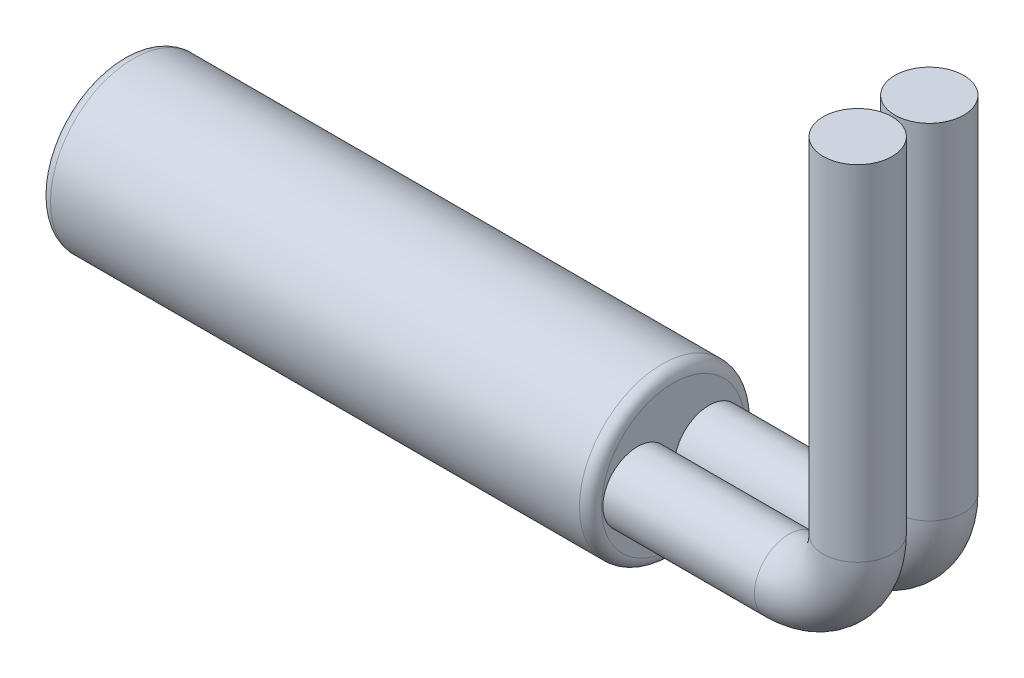
ISO-10303-21;
HEADER;
FILE_DESCRIPTION(('STEP AP214'),'2;1');
FILE_NAME('part.step','',(''),(''),'','','');
FILE_SCHEMA(('AUTOMOTIVE_DESIGN { 1 0 10303 214 1 1 1 1 }'));
ENDSEC;
DATA;
#1=APPLICATION_CONTEXT('core data for automotive mechanical design processes');
#2=APPLICATION_PROTOCOL_DEFINITION('international standard','automotive_design',2000,#1);
#3=PRODUCT_CONTEXT('',#1,'mechanical');
#4=PRODUCT('Part','Part','',(#3));
#5=PRODUCT_RELATED_PRODUCT_CATEGORY('part','',(#4));
#6=PRODUCT_DEFINITION_FORMATION('','',#4);
#7=PRODUCT_DEFINITION_CONTEXT('part definition',#1,'design');
#8=PRODUCT_DEFINITION('design','',#6,#7);
#9=PRODUCT_DEFINITION_SHAPE('','',#8);
#10=(LENGTH_UNIT() NAMED_UNIT(*) SI_UNIT(.MILLI.,.METRE.));
#11=(NAMED_UNIT(*) PLANE_ANGLE_UNIT() SI_UNIT($,.RADIAN.));
#12=(NAMED_UNIT(*) SI_UNIT($,.STERADIAN.) SOLID_ANGLE_UNIT());
#13=UNCERTAINTY_MEASURE_WITH_UNIT(LENGTH_MEASURE(1.E-05),#10,'distance_accuracy_value','');
#14=(GEOMETRIC_REPRESENTATION_CONTEXT(3) GLOBAL_UNCERTAINTY_ASSIGNED_CONTEXT((#13)) GLOBAL_UNIT_ASSIGNED_CONTEXT((#10,
#11,#12)) REPRESENTATION_CONTEXT('',''));
#15=CARTESIAN_POINT('',(0.,0.,0.));
#16=DIRECTION('',(0.,0.,1.));
#17=DIRECTION('',(1.,0.,0.));
#18=AXIS2_PLACEMENT_3D('',#15,#16,#17);
#19=CARTESIAN_POINT('',(-10.,9.,6.5));
#20=DIRECTION('',(-1.,0.,0.));
#21=DIRECTION('',(0.,1.,0.));
#22=AXIS2_PLACEMENT_3D('',#19,#20,#21);
#23=PLANE('',#22);
#24=CARTESIAN_POINT('',(-10.,9.,6.5));
#25=DIRECTION('',(1.,0.,0.));
#26=DIRECTION('',(0.,0.,-1.));
#27=AXIS2_PLACEMENT_3D('',#24,#25,#26);
#28=CIRCLE('',#27,2.6);
#29=CARTESIAN_POINT('',(-10.,9.,9.1));
#30=VERTEX_POINT('',#29);
#31=CARTESIAN_POINT('',(-10.,9.,3.9));
#32=VERTEX_POINT('',#31);
#33=EDGE_CURVE('E265',#30,#32,#28,.T.);
#34=ORIENTED_EDGE('',*,*,#33,.F.);
#35=CARTESIAN_POINT('',(-10.,9.,6.5));
#36=DIRECTION('',(1.,0.,0.));
#37=DIRECTION('',(0.,0.,-1.));
#38=AXIS2_PLACEMENT_3D('',#35,#36,#37);
#39=CIRCLE('',#38,2.6);
#40=EDGE_CURVE('E10',#32,#30,#39,.T.);
#41=ORIENTED_EDGE('',*,*,#40,.F.);
#42=EDGE_LOOP('',(#34,#41));
#43=FACE_BOUND('',#42,.T.);
#44=ADVANCED_FACE('F15',(#43),#23,.T.);
#45=CARTESIAN_POINT('',(-9.6,9.,6.5));
#46=DIRECTION('',(-1.,0.,0.));
#47=DIRECTION('',(0.,0.,1.));
#48=AXIS2_PLACEMENT_3D('',#45,#46,#47);
#49=TOROIDAL_SURFACE('',#48,2.6,0.4);
#50=ORIENTED_EDGE('',*,*,#33,.T.);
#51=CARTESIAN_POINT('',(-9.6,9.,3.9));
#52=DIRECTION('',(0.,-1.,0.));
#53=DIRECTION('',(0.,0.,-1.));
#54=AXIS2_PLACEMENT_3D('',#51,#52,#53);
#55=CIRCLE('',#54,0.4);
#56=CARTESIAN_POINT('',(-9.6,9.,3.5));
#57=VERTEX_POINT('',#56);
#58=EDGE_CURVE('E26',#32,#57,#55,.T.);
#59=ORIENTED_EDGE('',*,*,#58,.T.);
#60=CARTESIAN_POINT('',(-9.6,9.,6.5));
#61=DIRECTION('',(-1.,0.,0.));
#62=DIRECTION('',(0.,0.,-1.));
#63=AXIS2_PLACEMENT_3D('',#60,#61,#62);
#64=CIRCLE('',#63,3.);
#65=CARTESIAN_POINT('',(-9.6,9.,9.5));
#66=VERTEX_POINT('',#65);
#67=EDGE_CURVE('E273',#57,#66,#64,.T.);
#68=ORIENTED_EDGE('',*,*,#67,.T.);
#69=CARTESIAN_POINT('',(-9.6,9.,6.5));
#70=DIRECTION('',(-1.,0.,0.));
#71=DIRECTION('',(0.,0.,-1.));
#72=AXIS2_PLACEMENT_3D('',#69,#70,#71);
#73=CIRCLE('',#72,3.);
#74=EDGE_CURVE('E276',#66,#57,#73,.T.);
#75=ORIENTED_EDGE('',*,*,#74,.T.);
#76=ORIENTED_EDGE('',*,*,#58,.F.);
#77=ORIENTED_EDGE('',*,*,#40,.T.);
#78=EDGE_LOOP('',(#50,#59,#68,#75,#76,#77));
#79=FACE_BOUND('',#78,.T.);
#80=ADVANCED_FACE('F229',(#79),#49,.T.);
#81=CARTESIAN_POINT('',(10.,9.,6.5));
#82=DIRECTION('',(1.,0.,0.));
#83=DIRECTION('',(0.,1.,0.));
#84=AXIS2_PLACEMENT_3D('',#81,#82,#83);
#85=PLANE('',#84);
#86=CARTESIAN_POINT('',(10.,9.,7.8));
#87=DIRECTION('',(-1.,0.,0.));
#88=DIRECTION('',(0.,0.,1.));
#89=AXIS2_PLACEMENT_3D('',#86,#87,#88);
#90=CIRCLE('',#89,1.25);
#91=CARTESIAN_POINT('',(10.,9.,9.05));
#92=VERTEX_POINT('',#91);
#93=CARTESIAN_POINT('',(10.,9.,6.55));
#94=VERTEX_POINT('',#93);
#95=EDGE_CURVE('E136',#92,#94,#90,.T.);
#96=ORIENTED_EDGE('',*,*,#95,.T.);
#97=CARTESIAN_POINT('',(10.,9.,7.8));
#98=DIRECTION('',(-1.,0.,0.));
#99=DIRECTION('',(0.,0.,1.));
#100=AXIS2_PLACEMENT_3D('',#97,#98,#99);
#101=CIRCLE('',#100,1.25);
#102=EDGE_CURVE('E179',#94,#92,#101,.T.);
#103=ORIENTED_EDGE('',*,*,#102,.T.);
#104=EDGE_LOOP('',(#96,#103));
#105=FACE_BOUND('',#104,.T.);
#106=CARTESIAN_POINT('',(10.,9.,5.2));
#107=DIRECTION('',(-1.,0.,0.));
#108=DIRECTION('',(0.,0.,1.));
#109=AXIS2_PLACEMENT_3D('',#106,#107,#108);
#110=CIRCLE('',#109,1.25);
#111=CARTESIAN_POINT('',(10.,9.,6.45));
#112=VERTEX_POINT('',#111);
#113=CARTESIAN_POINT('',(10.,9.,3.95));
#114=VERTEX_POINT('',#113);
#115=EDGE_CURVE('E187',#112,#114,#110,.T.);
#116=ORIENTED_EDGE('',*,*,#115,.T.);
#117=CARTESIAN_POINT('',(10.,9.,5.2));
#118=DIRECTION('',(-1.,0.,0.));
#119=DIRECTION('',(0.,0.,1.));
#120=AXIS2_PLACEMENT_3D('',#117,#118,#119);
#121=CIRCLE('',#120,1.25);
#122=EDGE_CURVE('E184',#114,#112,#121,.T.);
#123=ORIENTED_EDGE('',*,*,#122,.T.);
#124=EDGE_LOOP('',(#116,#123));
#125=FACE_BOUND('',#124,.T.);
#126=CARTESIAN_POINT('',(10.,9.,6.5));
#127=DIRECTION('',(-1.,0.,0.));
#128=DIRECTION('',(0.,0.,-1.));
#129=AXIS2_PLACEMENT_3D('',#126,#127,#128);
#130=CIRCLE('',#129,2.6);
#131=CARTESIAN_POINT('',(10.,9.,9.1));
#132=VERTEX_POINT('',#131);
#133=CARTESIAN_POINT('',(10.,9.,3.9));
#134=VERTEX_POINT('',#133);
#135=EDGE_CURVE('E162',#132,#134,#130,.T.);
#136=ORIENTED_EDGE('',*,*,#135,.F.);
#137=CARTESIAN_POINT('',(10.,9.,6.5));
#138=DIRECTION('',(-1.,0.,0.));
#139=DIRECTION('',(0.,0.,-1.));
#140=AXIS2_PLACEMENT_3D('',#137,#138,#139);
#141=CIRCLE('',#140,2.6);
#142=EDGE_CURVE('E166',#134,#132,#141,.T.);
#143=ORIENTED_EDGE('',*,*,#142,.F.);
#144=EDGE_LOOP('',(#136,#143));
#145=FACE_BOUND('',#144,.T.);
#146=ADVANCED_FACE('F234',(#105,#125,#145),#85,.T.);
#147=CARTESIAN_POINT('',(10.,9.,6.5));
#148=DIRECTION('',(-1.,0.,0.));
#149=DIRECTION('',(0.,0.,1.));
#150=AXIS2_PLACEMENT_3D('',#147,#148,#149);
#151=CYLINDRICAL_SURFACE('',#150,3.);
#152=ORIENTED_EDGE('',*,*,#74,.F.);
#153=ORIENTED_EDGE('',*,*,#67,.F.);
#154=DIRECTION('',(1.,0.,0.));
#155=VECTOR('',#154,1.);
#156=CARTESIAN_POINT('',(10.,9.,3.5));
#157=LINE('',#156,#155);
#158=CARTESIAN_POINT('',(9.6,9.,3.5));
#159=VERTEX_POINT('',#158);
#160=EDGE_CURVE('E269',#57,#159,#157,.T.);
#161=ORIENTED_EDGE('',*,*,#160,.T.);
#162=CARTESIAN_POINT('',(9.6,9.,6.5));
#163=DIRECTION('',(1.,0.,0.));
#164=DIRECTION('',(0.,0.,-1.));
#165=AXIS2_PLACEMENT_3D('',#162,#163,#164);
#166=CIRCLE('',#165,3.);
#167=CARTESIAN_POINT('',(9.6,9.,9.5));
#168=VERTEX_POINT('',#167);
#169=EDGE_CURVE('E167',#168,#159,#166,.T.);
#170=ORIENTED_EDGE('',*,*,#169,.F.);
#171=CARTESIAN_POINT('',(9.6,9.,6.5));
#172=DIRECTION('',(1.,0.,0.));
#173=DIRECTION('',(0.,0.,-1.));
#174=AXIS2_PLACEMENT_3D('',#171,#172,#173);
#175=CIRCLE('',#174,3.);
#176=EDGE_CURVE('E165',#159,#168,#175,.T.);
#177=ORIENTED_EDGE('',*,*,#176,.F.);
#178=ORIENTED_EDGE('',*,*,#160,.F.);
#179=EDGE_LOOP('',(#152,#153,#161,#170,#177,#178));
#180=FACE_BOUND('',#179,.T.);
#181=ADVANCED_FACE('F223',(#180),#151,.T.);
#182=CARTESIAN_POINT('',(9.6,9.,6.5));
#183=DIRECTION('',(-1.,0.,0.));
#184=DIRECTION('',(0.,0.,1.));
#185=AXIS2_PLACEMENT_3D('',#182,#183,#184);
#186=TOROIDAL_SURFACE('',#185,2.6,0.4);
#187=ORIENTED_EDGE('',*,*,#169,.T.);
#188=CARTESIAN_POINT('',(9.6,9.,3.9));
#189=DIRECTION('',(0.,-1.,0.));
#190=DIRECTION('',(0.,0.,-1.));
#191=AXIS2_PLACEMENT_3D('',#188,#189,#190);
#192=CIRCLE('',#191,0.4);
#193=EDGE_CURVE('E171',#159,#134,#192,.T.);
#194=ORIENTED_EDGE('',*,*,#193,.T.);
#195=ORIENTED_EDGE('',*,*,#142,.T.);
#196=ORIENTED_EDGE('',*,*,#135,.T.);
#197=ORIENTED_EDGE('',*,*,#193,.F.);
#198=ORIENTED_EDGE('',*,*,#176,.T.);
#199=EDGE_LOOP('',(#187,#194,#195,#196,#197,#198));
#200=FACE_BOUND('',#199,.T.);
#201=ADVANCED_FACE('F214',(#200),#186,.T.);
#202=CARTESIAN_POINT('',(18.,24.,7.8));
#203=DIRECTION('',(0.,1.,0.));
#204=DIRECTION('',(0.,0.,-1.));
#205=AXIS2_PLACEMENT_3D('',#202,#203,#204);
#206=PLANE('',#205);
#207=CARTESIAN_POINT('',(18.,24.,7.8));
#208=DIRECTION('',(0.,1.,0.));
#209=DIRECTION('',(0.,0.,-1.));
#210=AXIS2_PLACEMENT_3D('',#207,#208,#209);
#211=CIRCLE('',#210,1.25);
#212=CARTESIAN_POINT('',(19.25,24.,7.8));
#213=VERTEX_POINT('',#212);
#214=CARTESIAN_POINT('',(16.75,24.,7.8));
#215=VERTEX_POINT('',#214);
#216=EDGE_CURVE('E183',#213,#215,#211,.T.);
#217=ORIENTED_EDGE('',*,*,#216,.T.);
#218=CARTESIAN_POINT('',(18.,24.,7.8));
#219=DIRECTION('',(0.,1.,0.));
#220=DIRECTION('',(0.,0.,-1.));
#221=AXIS2_PLACEMENT_3D('',#218,#219,#220);
#222=CIRCLE('',#221,1.25);
#223=EDGE_CURVE('E133',#215,#213,#222,.T.);
#224=ORIENTED_EDGE('',*,*,#223,.T.);
#225=EDGE_LOOP('',(#217,#224));
#226=FACE_BOUND('',#225,.T.);
#227=ADVANCED_FACE('F211',(#226),#206,.T.);
#228=CARTESIAN_POINT('',(13.,9.,7.8));
#229=DIRECTION('',(-1.,0.,0.));
#230=DIRECTION('',(0.,0.,1.));
#231=AXIS2_PLACEMENT_3D('',#228,#229,#230);
#232=CYLINDRICAL_SURFACE('',#231,1.25);
#233=ORIENTED_EDGE('',*,*,#95,.F.);
#234=ORIENTED_EDGE('',*,*,#102,.F.);
#235=DIRECTION('',(1.,0.,0.));
#236=VECTOR('',#235,1.);
#237=CARTESIAN_POINT('',(13.,9.,6.55));
#238=LINE('',#237,#236);
#239=CARTESIAN_POINT('',(15.5,9.,6.55));
#240=VERTEX_POINT('',#239);
#241=EDGE_CURVE('E172',#94,#240,#238,.T.);
#242=ORIENTED_EDGE('',*,*,#241,.T.);
#243=CARTESIAN_POINT('',(15.5,9.,7.8));
#244=DIRECTION('',(1.,0.,0.));
#245=DIRECTION('',(0.,0.,-1.));
#246=AXIS2_PLACEMENT_3D('',#243,#244,#245);
#247=CIRCLE('',#246,1.25);
#248=CARTESIAN_POINT('',(15.5,9.,9.05));
#249=VERTEX_POINT('',#248);
#250=EDGE_CURVE('E155',#249,#240,#247,.T.);
#251=ORIENTED_EDGE('',*,*,#250,.F.);
#252=CARTESIAN_POINT('',(15.5,9.,7.8));
#253=DIRECTION('',(1.,0.,0.));
#254=DIRECTION('',(0.,0.,-1.));
#255=AXIS2_PLACEMENT_3D('',#252,#253,#254);
#256=CIRCLE('',#255,1.25);
#257=CARTESIAN_POINT('',(15.5,10.25,7.8));
#258=VERTEX_POINT('',#257);
#259=EDGE_CURVE('E148',#258,#249,#256,.T.);
#260=ORIENTED_EDGE('',*,*,#259,.F.);
#261=CARTESIAN_POINT('',(15.5,9.,7.8));
#262=DIRECTION('',(1.,0.,0.));
#263=DIRECTION('',(0.,0.,-1.));
#264=AXIS2_PLACEMENT_3D('',#261,#262,#263);
#265=CIRCLE('',#264,1.25);
#266=EDGE_CURVE('E144',#240,#258,#265,.T.);
#267=ORIENTED_EDGE('',*,*,#266,.F.);
#268=ORIENTED_EDGE('',*,*,#241,.F.);
#269=EDGE_LOOP('',(#233,#234,#242,#251,#260,#267,#268));
#270=FACE_BOUND('',#269,.T.);
#271=ADVANCED_FACE('F213',(#270),#232,.T.);
#272=CARTESIAN_POINT('',(18.,11.5,7.8));
#273=DIRECTION('',(0.,1.,0.));
#274=DIRECTION('',(1.,0.,0.));
#275=AXIS2_PLACEMENT_3D('',#272,#273,#274);
#276=CYLINDRICAL_SURFACE('',#275,1.25);
#277=ORIENTED_EDGE('',*,*,#216,.F.);
#278=ORIENTED_EDGE('',*,*,#223,.F.);
#279=DIRECTION('',(0.,-1.,0.));
#280=VECTOR('',#279,1.);
#281=CARTESIAN_POINT('',(16.75,11.5,7.8));
#282=LINE('',#281,#280);
#283=CARTESIAN_POINT('',(16.75,11.5,7.8));
#284=VERTEX_POINT('',#283);
#285=EDGE_CURVE('E128',#215,#284,#282,.T.);
#286=ORIENTED_EDGE('',*,*,#285,.T.);
#287=CARTESIAN_POINT('',(18.,11.5,7.8));
#288=DIRECTION('',(0.,1.,0.));
#289=DIRECTION('',(0.,0.,-1.));
#290=AXIS2_PLACEMENT_3D('',#287,#288,#289);
#291=CIRCLE('',#290,1.25);
#292=EDGE_CURVE('E132',#284,#284,#291,.T.);
#293=ORIENTED_EDGE('',*,*,#292,.T.);
#294=ORIENTED_EDGE('',*,*,#285,.F.);
#295=EDGE_LOOP('',(#277,#278,#286,#293,#294));
#296=FACE_BOUND('',#295,.T.);
#297=ADVANCED_FACE('F17',(#296),#276,.T.);
#298=CARTESIAN_POINT('',(15.5,11.5,7.8));
#299=DIRECTION('',(0.,0.,1.));
#300=DIRECTION('',(1.,0.,0.));
#301=AXIS2_PLACEMENT_3D('',#298,#299,#300);
#302=TOROIDAL_SURFACE('',#301,2.5,1.25);
#303=ORIENTED_EDGE('',*,*,#292,.F.);
#304=CARTESIAN_POINT('',(15.5,11.5,7.8));
#305=DIRECTION('',(0.,0.,-1.));
#306=DIRECTION('',(1.,0.,0.));
#307=AXIS2_PLACEMENT_3D('',#304,#305,#306);
#308=CIRCLE('',#307,1.25);
#309=EDGE_CURVE('E140',#284,#258,#308,.T.);
#310=ORIENTED_EDGE('',*,*,#309,.T.);
#311=ORIENTED_EDGE('',*,*,#259,.T.);
#312=ORIENTED_EDGE('',*,*,#250,.T.);
#313=ORIENTED_EDGE('',*,*,#266,.T.);
#314=ORIENTED_EDGE('',*,*,#309,.F.);
#315=EDGE_LOOP('',(#303,#310,#311,#312,#313,#314));
#316=FACE_BOUND('',#315,.T.);
#317=ADVANCED_FACE('F141',(#316),#302,.T.);
#318=CARTESIAN_POINT('',(18.,24.,5.2));
#319=DIRECTION('',(0.,1.,0.));
#320=DIRECTION('',(0.,0.,-1.));
#321=AXIS2_PLACEMENT_3D('',#318,#319,#320);
#322=PLANE('',#321);
#323=CARTESIAN_POINT('',(18.,24.,5.2));
#324=DIRECTION('',(0.,1.,0.));
#325=DIRECTION('',(0.,0.,-1.));
#326=AXIS2_PLACEMENT_3D('',#323,#324,#325);
#327=CIRCLE('',#326,1.25);
#328=CARTESIAN_POINT('',(19.25,24.,5.2));
#329=VERTEX_POINT('',#328);
#330=CARTESIAN_POINT('',(16.75,24.,5.2));
#331=VERTEX_POINT('',#330);
#332=EDGE_CURVE('E253',#329,#331,#327,.T.);
#333=ORIENTED_EDGE('',*,*,#332,.T.);
#334=CARTESIAN_POINT('',(18.,24.,5.2));
#335=DIRECTION('',(0.,1.,0.));
#336=DIRECTION('',(0.,0.,-1.));
#337=AXIS2_PLACEMENT_3D('',#334,#335,#336);
#338=CIRCLE('',#337,1.25);
#339=EDGE_CURVE('E205',#331,#329,#338,.T.);
#340=ORIENTED_EDGE('',*,*,#339,.T.);
#341=EDGE_LOOP('',(#333,#340));
#342=FACE_BOUND('',#341,.T.);
#343=ADVANCED_FACE('F241',(#342),#322,.T.);
#344=CARTESIAN_POINT('',(13.,9.,5.2));
#345=DIRECTION('',(-1.,0.,0.));
#346=DIRECTION('',(0.,0.,1.));
#347=AXIS2_PLACEMENT_3D('',#344,#345,#346);
#348=CYLINDRICAL_SURFACE('',#347,1.25);
#349=ORIENTED_EDGE('',*,*,#115,.F.);
#350=ORIENTED_EDGE('',*,*,#122,.F.);
#351=DIRECTION('',(1.,0.,0.));
#352=VECTOR('',#351,1.);
#353=CARTESIAN_POINT('',(13.,9.,3.95));
#354=LINE('',#353,#352);
#355=CARTESIAN_POINT('',(15.5,9.,3.95));
#356=VERTEX_POINT('',#355);
#357=EDGE_CURVE('E157',#114,#356,#354,.T.);
#358=ORIENTED_EDGE('',*,*,#357,.T.);
#359=CARTESIAN_POINT('',(15.5,9.,5.2));
#360=DIRECTION('',(1.,0.,0.));
#361=DIRECTION('',(0.,0.,-1.));
#362=AXIS2_PLACEMENT_3D('',#359,#360,#361);
#363=CIRCLE('',#362,1.25);
#364=CARTESIAN_POINT('',(15.5,9.,6.45));
#365=VERTEX_POINT('',#364);
#366=EDGE_CURVE('E177',#365,#356,#363,.T.);
#367=ORIENTED_EDGE('',*,*,#366,.F.);
#368=CARTESIAN_POINT('',(15.5,9.,5.2));
#369=DIRECTION('',(1.,0.,0.));
#370=DIRECTION('',(0.,0.,-1.));
#371=AXIS2_PLACEMENT_3D('',#368,#369,#370);
#372=CIRCLE('',#371,1.25);
#373=CARTESIAN_POINT('',(15.5,10.25,5.2));
#374=VERTEX_POINT('',#373);
#375=EDGE_CURVE('E173',#374,#365,#372,.T.);
#376=ORIENTED_EDGE('',*,*,#375,.F.);
#377=CARTESIAN_POINT('',(15.5,9.,5.2));
#378=DIRECTION('',(1.,0.,0.));
#379=DIRECTION('',(0.,0.,-1.));
#380=AXIS2_PLACEMENT_3D('',#377,#378,#379);
#381=CIRCLE('',#380,1.25);
#382=EDGE_CURVE('E257',#356,#374,#381,.T.);
#383=ORIENTED_EDGE('',*,*,#382,.F.);
#384=ORIENTED_EDGE('',*,*,#357,.F.);
#385=EDGE_LOOP('',(#349,#350,#358,#367,#376,#383,#384));
#386=FACE_BOUND('',#385,.T.);
#387=ADVANCED_FACE('F238',(#386),#348,.T.);
#388=CARTESIAN_POINT('',(18.,11.5,5.2));
#389=DIRECTION('',(0.,1.,0.));
#390=DIRECTION('',(1.,0.,0.));
#391=AXIS2_PLACEMENT_3D('',#388,#389,#390);
#392=CYLINDRICAL_SURFACE('',#391,1.25);
#393=ORIENTED_EDGE('',*,*,#332,.F.);
#394=ORIENTED_EDGE('',*,*,#339,.F.);
#395=DIRECTION('',(0.,-1.,0.));
#396=VECTOR('',#395,1.);
#397=CARTESIAN_POINT('',(16.75,11.5,5.2));
#398=LINE('',#397,#396);
#399=CARTESIAN_POINT('',(16.75,11.5,5.2));
#400=VERTEX_POINT('',#399);
#401=EDGE_CURVE('E193',#331,#400,#398,.T.);
#402=ORIENTED_EDGE('',*,*,#401,.T.);
#403=CARTESIAN_POINT('',(18.,11.5,5.2));
#404=DIRECTION('',(0.,1.,0.));
#405=DIRECTION('',(0.,0.,-1.));
#406=AXIS2_PLACEMENT_3D('',#403,#404,#405);
#407=CIRCLE('',#406,1.25);
#408=EDGE_CURVE('E277',#400,#400,#407,.T.);
#409=ORIENTED_EDGE('',*,*,#408,.T.);
#410=ORIENTED_EDGE('',*,*,#401,.F.);
#411=EDGE_LOOP('',(#393,#394,#402,#409,#410));
#412=FACE_BOUND('',#411,.T.);
#413=ADVANCED_FACE('F240',(#412),#392,.T.);
#414=CARTESIAN_POINT('',(15.5,11.5,5.2));
#415=DIRECTION('',(0.,0.,1.));
#416=DIRECTION('',(1.,0.,0.));
#417=AXIS2_PLACEMENT_3D('',#414,#415,#416);
#418=TOROIDAL_SURFACE('',#417,2.5,1.25);
#419=ORIENTED_EDGE('',*,*,#408,.F.);
#420=CARTESIAN_POINT('',(15.5,11.5,5.2));
#421=DIRECTION('',(0.,0.,-1.));
#422=DIRECTION('',(1.,0.,0.));
#423=AXIS2_PLACEMENT_3D('',#420,#421,#422);
#424=CIRCLE('',#423,1.25);
#425=EDGE_CURVE('E19',#400,#374,#424,.T.);
#426=ORIENTED_EDGE('',*,*,#425,.T.);
#427=ORIENTED_EDGE('',*,*,#375,.T.);
#428=ORIENTED_EDGE('',*,*,#366,.T.);
#429=ORIENTED_EDGE('',*,*,#382,.T.);
#430=ORIENTED_EDGE('',*,*,#425,.F.);
#431=EDGE_LOOP('',(#419,#426,#427,#428,#429,#430));
#432=FACE_BOUND('',#431,.T.);
#433=ADVANCED_FACE('F310',(#432),#418,.T.);
#434=CLOSED_SHELL('',(#44,#80,#146,#181,#201,#227,#271,#297,#317,#343,#387,#413,#433));
#435=MANIFOLD_SOLID_BREP('B1',#434);
#436=ADVANCED_BREP_SHAPE_REPRESENTATION('',(#18,#435),#14);
#437=SHAPE_DEFINITION_REPRESENTATION(#9,#436);
ENDSEC;
END-ISO-10303-21;
